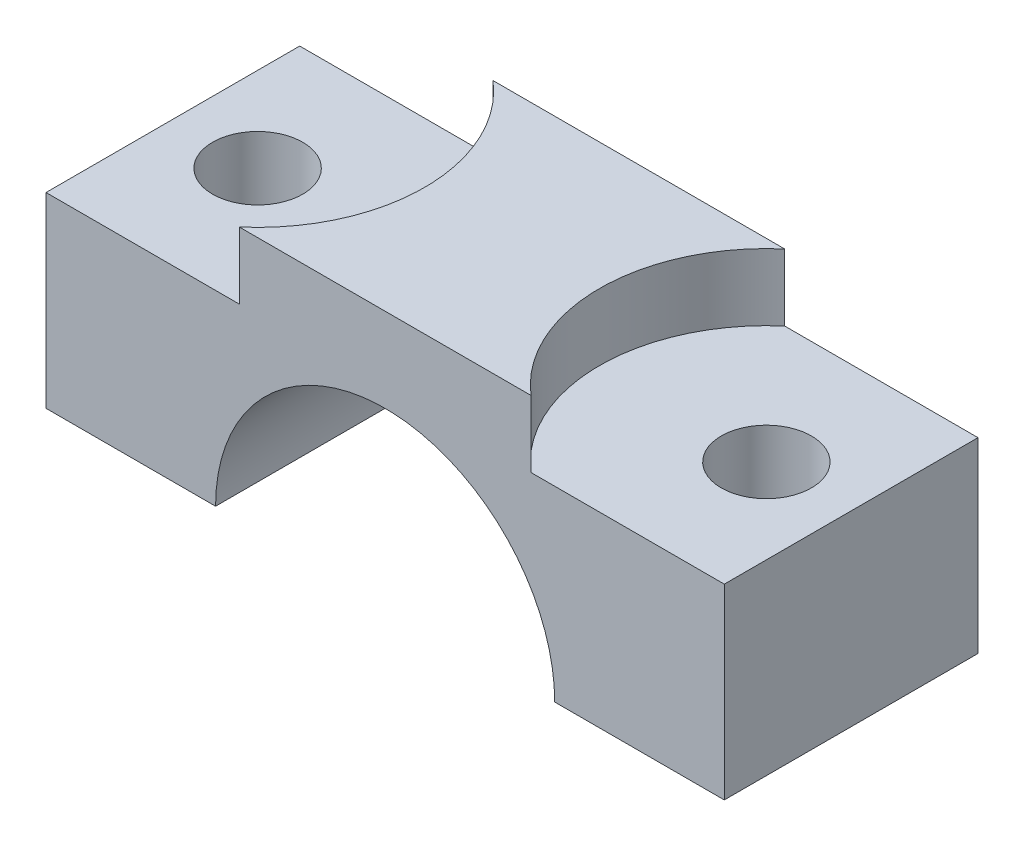
ISO-10303-21;
HEADER;
FILE_DESCRIPTION(('STEP AP214'),'2;1');
FILE_NAME('part.step','',(''),(''),'','','');
FILE_SCHEMA(('AUTOMOTIVE_DESIGN { 1 0 10303 214 1 1 1 1 }'));
ENDSEC;
DATA;
#1=APPLICATION_CONTEXT('core data for automotive mechanical design processes');
#2=APPLICATION_PROTOCOL_DEFINITION('international standard','automotive_design',2000,#1);
#3=PRODUCT_CONTEXT('',#1,'mechanical');
#4=PRODUCT('Part','Part','',(#3));
#5=PRODUCT_RELATED_PRODUCT_CATEGORY('part','',(#4));
#6=PRODUCT_DEFINITION_FORMATION('','',#4);
#7=PRODUCT_DEFINITION_CONTEXT('part definition',#1,'design');
#8=PRODUCT_DEFINITION('design','',#6,#7);
#9=PRODUCT_DEFINITION_SHAPE('','',#8);
#10=(LENGTH_UNIT() NAMED_UNIT(*) SI_UNIT(.MILLI.,.METRE.));
#11=(NAMED_UNIT(*) PLANE_ANGLE_UNIT() SI_UNIT($,.RADIAN.));
#12=(NAMED_UNIT(*) SI_UNIT($,.STERADIAN.) SOLID_ANGLE_UNIT());
#13=UNCERTAINTY_MEASURE_WITH_UNIT(LENGTH_MEASURE(1.E-05),#10,'distance_accuracy_value','');
#14=(GEOMETRIC_REPRESENTATION_CONTEXT(3) GLOBAL_UNCERTAINTY_ASSIGNED_CONTEXT((#13)) GLOBAL_UNIT_ASSIGNED_CONTEXT((#10,
#11,#12)) REPRESENTATION_CONTEXT('',''));
#15=CARTESIAN_POINT('',(0.,0.,0.));
#16=DIRECTION('',(0.,0.,1.));
#17=DIRECTION('',(1.,0.,0.));
#18=AXIS2_PLACEMENT_3D('',#15,#16,#17);
#19=CARTESIAN_POINT('',(-25.4,19.,9.5));
#20=DIRECTION('',(0.,-1.,0.));
#21=DIRECTION('',(0.,0.,-1.));
#22=AXIS2_PLACEMENT_3D('',#19,#20,#21);
#23=PLANE('',#22);
#24=CARTESIAN_POINT('',(-19.05,19.,0.));
#25=DIRECTION('',(0.,1.,0.));
#26=DIRECTION('',(0.,0.,1.));
#27=AXIS2_PLACEMENT_3D('',#24,#25,#26);
#28=CIRCLE('',#27,12.5);
#29=CARTESIAN_POINT('',(-10.925961595364,19.,9.5));
#30=VERTEX_POINT('',#29);
#31=CARTESIAN_POINT('',(-10.925961595364,19.,-9.5));
#32=VERTEX_POINT('',#31);
#33=EDGE_CURVE('E56',#30,#32,#28,.T.);
#34=ORIENTED_EDGE('',*,*,#33,.F.);
#35=DIRECTION('',(-1.,0.,0.));
#36=VECTOR('',#35,1.);
#37=CARTESIAN_POINT('',(-25.4,19.,9.5));
#38=LINE('',#37,#36);
#39=CARTESIAN_POINT('',(10.925961595364,19.,9.5));
#40=VERTEX_POINT('',#39);
#41=EDGE_CURVE('E130',#40,#30,#38,.T.);
#42=ORIENTED_EDGE('',*,*,#41,.F.);
#43=CARTESIAN_POINT('',(19.05,19.,0.));
#44=DIRECTION('',(0.,1.,0.));
#45=DIRECTION('',(0.,0.,1.));
#46=AXIS2_PLACEMENT_3D('',#43,#44,#45);
#47=CIRCLE('',#46,12.5);
#48=CARTESIAN_POINT('',(10.925961595364,19.,-9.5));
#49=VERTEX_POINT('',#48);
#50=EDGE_CURVE('E192',#49,#40,#47,.T.);
#51=ORIENTED_EDGE('',*,*,#50,.F.);
#52=DIRECTION('',(-1.,0.,0.));
#53=VECTOR('',#52,1.);
#54=CARTESIAN_POINT('',(-25.4,19.,-9.5));
#55=LINE('',#54,#53);
#56=EDGE_CURVE('E132',#49,#32,#55,.T.);
#57=ORIENTED_EDGE('',*,*,#56,.T.);
#58=EDGE_LOOP('',(#34,#42,#51,#57));
#59=FACE_BOUND('',#58,.T.);
#60=ADVANCED_FACE('F41',(#59),#23,.F.);
#61=CARTESIAN_POINT('',(-25.4,0.,9.5));
#62=DIRECTION('',(1.,0.,0.));
#63=DIRECTION('',(0.,0.,-1.));
#64=AXIS2_PLACEMENT_3D('',#61,#62,#63);
#65=PLANE('',#64);
#66=DIRECTION('',(0.,-1.,0.));
#67=VECTOR('',#66,1.);
#68=CARTESIAN_POINT('',(-25.4,0.,9.5));
#69=LINE('',#68,#67);
#70=CARTESIAN_POINT('',(-25.4,14.,9.5));
#71=VERTEX_POINT('',#70);
#72=CARTESIAN_POINT('',(-25.4,0.,9.5));
#73=VERTEX_POINT('',#72);
#74=EDGE_CURVE('E160',#71,#73,#69,.T.);
#75=ORIENTED_EDGE('',*,*,#74,.F.);
#76=DIRECTION('',(0.,0.,-1.));
#77=VECTOR('',#76,1.);
#78=CARTESIAN_POINT('',(-25.4,14.,9.5));
#79=LINE('',#78,#77);
#80=CARTESIAN_POINT('',(-25.4,14.,-9.5));
#81=VERTEX_POINT('',#80);
#82=EDGE_CURVE('E123',#71,#81,#79,.T.);
#83=ORIENTED_EDGE('',*,*,#82,.T.);
#84=DIRECTION('',(0.,-1.,0.));
#85=VECTOR('',#84,1.);
#86=CARTESIAN_POINT('',(-25.4,0.,-9.5));
#87=LINE('',#86,#85);
#88=CARTESIAN_POINT('',(-25.4,0.,-9.5));
#89=VERTEX_POINT('',#88);
#90=EDGE_CURVE('E149',#81,#89,#87,.T.);
#91=ORIENTED_EDGE('',*,*,#90,.T.);
#92=DIRECTION('',(0.,0.,-1.));
#93=VECTOR('',#92,1.);
#94=CARTESIAN_POINT('',(-25.4,0.,9.5));
#95=LINE('',#94,#93);
#96=EDGE_CURVE('E167',#73,#89,#95,.T.);
#97=ORIENTED_EDGE('',*,*,#96,.F.);
#98=EDGE_LOOP('',(#75,#83,#91,#97));
#99=FACE_BOUND('',#98,.T.);
#100=ADVANCED_FACE('F43',(#99),#65,.F.);
#101=CARTESIAN_POINT('',(-25.4,0.,9.5));
#102=DIRECTION('',(0.,1.,0.));
#103=DIRECTION('',(0.,0.,1.));
#104=AXIS2_PLACEMENT_3D('',#101,#102,#103);
#105=PLANE('',#104);
#106=CARTESIAN_POINT('',(-19.05,0.,0.));
#107=DIRECTION('',(0.,1.,0.));
#108=DIRECTION('',(0.,0.,1.));
#109=AXIS2_PLACEMENT_3D('',#106,#107,#108);
#110=CIRCLE('',#109,3.375);
#111=CARTESIAN_POINT('',(-19.05,0.,3.375));
#112=VERTEX_POINT('',#111);
#113=EDGE_CURVE('E124',#112,#112,#110,.T.);
#114=ORIENTED_EDGE('',*,*,#113,.T.);
#115=EDGE_LOOP('',(#114));
#116=FACE_BOUND('',#115,.T.);
#117=DIRECTION('',(1.,0.,0.));
#118=VECTOR('',#117,1.);
#119=CARTESIAN_POINT('',(-25.4,0.,-9.5));
#120=LINE('',#119,#118);
#121=CARTESIAN_POINT('',(-12.7,0.,-9.5));
#122=VERTEX_POINT('',#121);
#123=EDGE_CURVE('E151',#89,#122,#120,.T.);
#124=ORIENTED_EDGE('',*,*,#123,.T.);
#125=DIRECTION('',(0.,0.,-1.));
#126=VECTOR('',#125,1.);
#127=CARTESIAN_POINT('',(-12.7,0.,9.5));
#128=LINE('',#127,#126);
#129=CARTESIAN_POINT('',(-12.7,0.,9.5));
#130=VERTEX_POINT('',#129);
#131=EDGE_CURVE('E164',#130,#122,#128,.T.);
#132=ORIENTED_EDGE('',*,*,#131,.F.);
#133=DIRECTION('',(1.,0.,0.));
#134=VECTOR('',#133,1.);
#135=CARTESIAN_POINT('',(-25.4,0.,9.5));
#136=LINE('',#135,#134);
#137=EDGE_CURVE('E208',#73,#130,#136,.T.);
#138=ORIENTED_EDGE('',*,*,#137,.F.);
#139=ORIENTED_EDGE('',*,*,#96,.T.);
#140=EDGE_LOOP('',(#124,#132,#138,#139));
#141=FACE_BOUND('',#140,.T.);
#142=ADVANCED_FACE('F245',(#116,#141),#105,.F.);
#143=CARTESIAN_POINT('',(0.,0.,9.5));
#144=DIRECTION('',(0.,0.,-1.));
#145=DIRECTION('',(-1.,0.,0.));
#146=AXIS2_PLACEMENT_3D('',#143,#144,#145);
#147=CYLINDRICAL_SURFACE('',#146,12.7);
#148=CARTESIAN_POINT('',(0.,0.,-9.5));
#149=DIRECTION('',(0.,0.,-1.));
#150=DIRECTION('',(-1.,0.,0.));
#151=AXIS2_PLACEMENT_3D('',#148,#149,#150);
#152=CIRCLE('',#151,12.7);
#153=CARTESIAN_POINT('',(12.7,0.,-9.5));
#154=VERTEX_POINT('',#153);
#155=EDGE_CURVE('E153',#122,#154,#152,.T.);
#156=ORIENTED_EDGE('',*,*,#155,.T.);
#157=DIRECTION('',(0.,0.,-1.));
#158=VECTOR('',#157,1.);
#159=CARTESIAN_POINT('',(12.7,0.,9.5));
#160=LINE('',#159,#158);
#161=CARTESIAN_POINT('',(12.7,0.,9.5));
#162=VERTEX_POINT('',#161);
#163=EDGE_CURVE('E142',#162,#154,#160,.T.);
#164=ORIENTED_EDGE('',*,*,#163,.F.);
#165=CARTESIAN_POINT('',(0.,0.,9.5));
#166=DIRECTION('',(0.,0.,-1.));
#167=DIRECTION('',(-1.,0.,0.));
#168=AXIS2_PLACEMENT_3D('',#165,#166,#167);
#169=CIRCLE('',#168,12.7);
#170=EDGE_CURVE('E210',#130,#162,#169,.T.);
#171=ORIENTED_EDGE('',*,*,#170,.F.);
#172=ORIENTED_EDGE('',*,*,#131,.T.);
#173=EDGE_LOOP('',(#156,#164,#171,#172));
#174=FACE_BOUND('',#173,.T.);
#175=ADVANCED_FACE('F253',(#174),#147,.F.);
#176=CARTESIAN_POINT('',(12.7,0.,9.5));
#177=DIRECTION('',(0.,1.,0.));
#178=DIRECTION('',(-1.,0.,0.));
#179=AXIS2_PLACEMENT_3D('',#176,#177,#178);
#180=PLANE('',#179);
#181=CARTESIAN_POINT('',(19.05,0.,0.));
#182=DIRECTION('',(0.,1.,0.));
#183=DIRECTION('',(0.,0.,1.));
#184=AXIS2_PLACEMENT_3D('',#181,#182,#183);
#185=CIRCLE('',#184,3.375);
#186=CARTESIAN_POINT('',(19.05,0.,3.375));
#187=VERTEX_POINT('',#186);
#188=EDGE_CURVE('E203',#187,#187,#185,.T.);
#189=ORIENTED_EDGE('',*,*,#188,.T.);
#190=EDGE_LOOP('',(#189));
#191=FACE_BOUND('',#190,.T.);
#192=DIRECTION('',(1.,0.,0.));
#193=VECTOR('',#192,1.);
#194=CARTESIAN_POINT('',(12.7,0.,-9.5));
#195=LINE('',#194,#193);
#196=CARTESIAN_POINT('',(25.4,0.,-9.5));
#197=VERTEX_POINT('',#196);
#198=EDGE_CURVE('E155',#154,#197,#195,.T.);
#199=ORIENTED_EDGE('',*,*,#198,.T.);
#200=DIRECTION('',(0.,0.,-1.));
#201=VECTOR('',#200,1.);
#202=CARTESIAN_POINT('',(25.4,0.,9.5));
#203=LINE('',#202,#201);
#204=CARTESIAN_POINT('',(25.4,0.,9.5));
#205=VERTEX_POINT('',#204);
#206=EDGE_CURVE('E138',#205,#197,#203,.T.);
#207=ORIENTED_EDGE('',*,*,#206,.F.);
#208=DIRECTION('',(1.,0.,0.));
#209=VECTOR('',#208,1.);
#210=CARTESIAN_POINT('',(12.7,0.,9.5));
#211=LINE('',#210,#209);
#212=EDGE_CURVE('E145',#162,#205,#211,.T.);
#213=ORIENTED_EDGE('',*,*,#212,.F.);
#214=ORIENTED_EDGE('',*,*,#163,.T.);
#215=EDGE_LOOP('',(#199,#207,#213,#214));
#216=FACE_BOUND('',#215,.T.);
#217=ADVANCED_FACE('F217',(#191,#216),#180,.F.);
#218=CARTESIAN_POINT('',(25.4,0.,9.5));
#219=DIRECTION('',(-1.,0.,0.));
#220=DIRECTION('',(0.,0.,1.));
#221=AXIS2_PLACEMENT_3D('',#218,#219,#220);
#222=PLANE('',#221);
#223=DIRECTION('',(0.,1.,0.));
#224=VECTOR('',#223,1.);
#225=CARTESIAN_POINT('',(25.4,0.,-9.5));
#226=LINE('',#225,#224);
#227=CARTESIAN_POINT('',(25.4,14.,-9.5));
#228=VERTEX_POINT('',#227);
#229=EDGE_CURVE('E157',#197,#228,#226,.T.);
#230=ORIENTED_EDGE('',*,*,#229,.T.);
#231=DIRECTION('',(0.,0.,1.));
#232=VECTOR('',#231,1.);
#233=CARTESIAN_POINT('',(25.4,14.,9.5));
#234=LINE('',#233,#232);
#235=CARTESIAN_POINT('',(25.4,14.,9.5));
#236=VERTEX_POINT('',#235);
#237=EDGE_CURVE('E64',#228,#236,#234,.T.);
#238=ORIENTED_EDGE('',*,*,#237,.T.);
#239=DIRECTION('',(0.,1.,0.));
#240=VECTOR('',#239,1.);
#241=CARTESIAN_POINT('',(25.4,0.,9.5));
#242=LINE('',#241,#240);
#243=EDGE_CURVE('E139',#205,#236,#242,.T.);
#244=ORIENTED_EDGE('',*,*,#243,.F.);
#245=ORIENTED_EDGE('',*,*,#206,.T.);
#246=EDGE_LOOP('',(#230,#238,#244,#245));
#247=FACE_BOUND('',#246,.T.);
#248=ADVANCED_FACE('F221',(#247),#222,.F.);
#249=CARTESIAN_POINT('',(0.,0.,9.5));
#250=DIRECTION('',(0.,0.,-1.));
#251=DIRECTION('',(-1.,0.,0.));
#252=AXIS2_PLACEMENT_3D('',#249,#250,#251);
#253=PLANE('',#252);
#254=DIRECTION('',(0.,1.,0.));
#255=VECTOR('',#254,1.);
#256=CARTESIAN_POINT('',(-10.925961595364,19.,9.5));
#257=LINE('',#256,#255);
#258=CARTESIAN_POINT('',(-10.925961595364,14.,9.5));
#259=VERTEX_POINT('',#258);
#260=EDGE_CURVE('E116',#30,#259,#257,.F.);
#261=ORIENTED_EDGE('',*,*,#260,.T.);
#262=DIRECTION('',(-1.,0.,0.));
#263=VECTOR('',#262,1.);
#264=CARTESIAN_POINT('',(0.,14.,9.5));
#265=LINE('',#264,#263);
#266=EDGE_CURVE('E181',#259,#71,#265,.T.);
#267=ORIENTED_EDGE('',*,*,#266,.T.);
#268=ORIENTED_EDGE('',*,*,#74,.T.);
#269=ORIENTED_EDGE('',*,*,#137,.T.);
#270=ORIENTED_EDGE('',*,*,#170,.T.);
#271=ORIENTED_EDGE('',*,*,#212,.T.);
#272=ORIENTED_EDGE('',*,*,#243,.T.);
#273=DIRECTION('',(-1.,0.,0.));
#274=VECTOR('',#273,1.);
#275=CARTESIAN_POINT('',(0.,14.,9.5));
#276=LINE('',#275,#274);
#277=CARTESIAN_POINT('',(10.925961595364,14.,9.5));
#278=VERTEX_POINT('',#277);
#279=EDGE_CURVE('E171',#236,#278,#276,.T.);
#280=ORIENTED_EDGE('',*,*,#279,.T.);
#281=DIRECTION('',(0.,1.,0.));
#282=VECTOR('',#281,1.);
#283=CARTESIAN_POINT('',(10.925961595364,19.,9.5));
#284=LINE('',#283,#282);
#285=EDGE_CURVE('E137',#278,#40,#284,.T.);
#286=ORIENTED_EDGE('',*,*,#285,.T.);
#287=ORIENTED_EDGE('',*,*,#41,.T.);
#288=EDGE_LOOP('',(#261,#267,#268,#269,#270,#271,#272,#280,#286,#287));
#289=FACE_BOUND('',#288,.T.);
#290=ADVANCED_FACE('F135',(#289),#253,.F.);
#291=CARTESIAN_POINT('',(0.,0.,-9.5));
#292=DIRECTION('',(0.,0.,-1.));
#293=DIRECTION('',(-1.,0.,0.));
#294=AXIS2_PLACEMENT_3D('',#291,#292,#293);
#295=PLANE('',#294);
#296=DIRECTION('',(-1.,0.,0.));
#297=VECTOR('',#296,1.);
#298=CARTESIAN_POINT('',(0.,14.,-9.5));
#299=LINE('',#298,#297);
#300=CARTESIAN_POINT('',(-10.925961595364,14.,-9.5));
#301=VERTEX_POINT('',#300);
#302=EDGE_CURVE('E11',#301,#81,#299,.T.);
#303=ORIENTED_EDGE('',*,*,#302,.F.);
#304=DIRECTION('',(0.,1.,0.));
#305=VECTOR('',#304,1.);
#306=CARTESIAN_POINT('',(-10.925961595364,19.,-9.5));
#307=LINE('',#306,#305);
#308=EDGE_CURVE('E49',#32,#301,#307,.F.);
#309=ORIENTED_EDGE('',*,*,#308,.F.);
#310=ORIENTED_EDGE('',*,*,#56,.F.);
#311=DIRECTION('',(0.,1.,0.));
#312=VECTOR('',#311,1.);
#313=CARTESIAN_POINT('',(10.925961595364,19.,-9.5));
#314=LINE('',#313,#312);
#315=CARTESIAN_POINT('',(10.925961595364,14.,-9.5));
#316=VERTEX_POINT('',#315);
#317=EDGE_CURVE('E175',#316,#49,#314,.T.);
#318=ORIENTED_EDGE('',*,*,#317,.F.);
#319=DIRECTION('',(-1.,0.,0.));
#320=VECTOR('',#319,1.);
#321=CARTESIAN_POINT('',(0.,14.,-9.5));
#322=LINE('',#321,#320);
#323=EDGE_CURVE('E173',#228,#316,#322,.T.);
#324=ORIENTED_EDGE('',*,*,#323,.F.);
#325=ORIENTED_EDGE('',*,*,#229,.F.);
#326=ORIENTED_EDGE('',*,*,#198,.F.);
#327=ORIENTED_EDGE('',*,*,#155,.F.);
#328=ORIENTED_EDGE('',*,*,#123,.F.);
#329=ORIENTED_EDGE('',*,*,#90,.F.);
#330=EDGE_LOOP('',(#303,#309,#310,#318,#324,#325,#326,#327,#328,#329));
#331=FACE_BOUND('',#330,.T.);
#332=ADVANCED_FACE('F185',(#331),#295,.T.);
#333=CARTESIAN_POINT('',(22.425,14.,0.));
#334=DIRECTION('',(0.,-1.,0.));
#335=DIRECTION('',(0.,0.,-1.));
#336=AXIS2_PLACEMENT_3D('',#333,#334,#335);
#337=PLANE('',#336);
#338=CARTESIAN_POINT('',(19.05,14.,0.));
#339=DIRECTION('',(0.,1.,0.));
#340=DIRECTION('',(0.,0.,1.));
#341=AXIS2_PLACEMENT_3D('',#338,#339,#340);
#342=CIRCLE('',#341,3.37500000000001);
#343=CARTESIAN_POINT('',(19.05,14.,3.37500000000001));
#344=VERTEX_POINT('',#343);
#345=EDGE_CURVE('E200',#344,#344,#342,.T.);
#346=ORIENTED_EDGE('',*,*,#345,.F.);
#347=EDGE_LOOP('',(#346));
#348=FACE_BOUND('',#347,.T.);
#349=ORIENTED_EDGE('',*,*,#237,.F.);
#350=ORIENTED_EDGE('',*,*,#323,.T.);
#351=CARTESIAN_POINT('',(19.05,14.,0.));
#352=DIRECTION('',(0.,1.,0.));
#353=DIRECTION('',(0.,0.,1.));
#354=AXIS2_PLACEMENT_3D('',#351,#352,#353);
#355=CIRCLE('',#354,12.5);
#356=EDGE_CURVE('E197',#316,#278,#355,.T.);
#357=ORIENTED_EDGE('',*,*,#356,.T.);
#358=ORIENTED_EDGE('',*,*,#279,.F.);
#359=EDGE_LOOP('',(#349,#350,#357,#358));
#360=FACE_BOUND('',#359,.T.);
#361=ADVANCED_FACE('F224',(#348,#360),#337,.F.);
#362=CARTESIAN_POINT('',(19.05,19.,0.));
#363=DIRECTION('',(0.,1.,0.));
#364=DIRECTION('',(0.,0.,1.));
#365=AXIS2_PLACEMENT_3D('',#362,#363,#364);
#366=CYLINDRICAL_SURFACE('',#365,3.375);
#367=ORIENTED_EDGE('',*,*,#188,.F.);
#368=EDGE_LOOP('',(#367));
#369=FACE_BOUND('',#368,.T.);
#370=ORIENTED_EDGE('',*,*,#345,.T.);
#371=EDGE_LOOP('',(#370));
#372=FACE_BOUND('',#371,.T.);
#373=ADVANCED_FACE('F228',(#369,#372),#366,.F.);
#374=CARTESIAN_POINT('',(19.05,19.,0.));
#375=DIRECTION('',(0.,1.,0.));
#376=DIRECTION('',(0.,0.,1.));
#377=AXIS2_PLACEMENT_3D('',#374,#375,#376);
#378=CYLINDRICAL_SURFACE('',#377,12.5);
#379=ORIENTED_EDGE('',*,*,#317,.T.);
#380=ORIENTED_EDGE('',*,*,#50,.T.);
#381=ORIENTED_EDGE('',*,*,#285,.F.);
#382=ORIENTED_EDGE('',*,*,#356,.F.);
#383=EDGE_LOOP('',(#379,#380,#381,#382));
#384=FACE_BOUND('',#383,.T.);
#385=ADVANCED_FACE('F226',(#384),#378,.F.);
#386=CARTESIAN_POINT('',(-15.675,14.,0.));
#387=DIRECTION('',(0.,-1.,0.));
#388=DIRECTION('',(0.,0.,-1.));
#389=AXIS2_PLACEMENT_3D('',#386,#387,#388);
#390=PLANE('',#389);
#391=CARTESIAN_POINT('',(-19.05,14.,0.));
#392=DIRECTION('',(0.,1.,0.));
#393=DIRECTION('',(0.,0.,1.));
#394=AXIS2_PLACEMENT_3D('',#391,#392,#393);
#395=CIRCLE('',#394,3.37500000000001);
#396=CARTESIAN_POINT('',(-19.05,14.,3.37500000000001));
#397=VERTEX_POINT('',#396);
#398=EDGE_CURVE('E182',#397,#397,#395,.T.);
#399=ORIENTED_EDGE('',*,*,#398,.F.);
#400=EDGE_LOOP('',(#399));
#401=FACE_BOUND('',#400,.T.);
#402=CARTESIAN_POINT('',(-19.05,14.,0.));
#403=DIRECTION('',(0.,1.,0.));
#404=DIRECTION('',(0.,0.,1.));
#405=AXIS2_PLACEMENT_3D('',#402,#403,#404);
#406=CIRCLE('',#405,12.5);
#407=EDGE_CURVE('E119',#259,#301,#406,.T.);
#408=ORIENTED_EDGE('',*,*,#407,.T.);
#409=ORIENTED_EDGE('',*,*,#302,.T.);
#410=ORIENTED_EDGE('',*,*,#82,.F.);
#411=ORIENTED_EDGE('',*,*,#266,.F.);
#412=EDGE_LOOP('',(#408,#409,#410,#411));
#413=FACE_BOUND('',#412,.T.);
#414=ADVANCED_FACE('F179',(#401,#413),#390,.F.);
#415=CARTESIAN_POINT('',(-19.05,19.,0.));
#416=DIRECTION('',(0.,1.,0.));
#417=DIRECTION('',(0.,0.,1.));
#418=AXIS2_PLACEMENT_3D('',#415,#416,#417);
#419=CYLINDRICAL_SURFACE('',#418,12.5);
#420=ORIENTED_EDGE('',*,*,#33,.T.);
#421=ORIENTED_EDGE('',*,*,#308,.T.);
#422=ORIENTED_EDGE('',*,*,#407,.F.);
#423=ORIENTED_EDGE('',*,*,#260,.F.);
#424=EDGE_LOOP('',(#420,#421,#422,#423));
#425=FACE_BOUND('',#424,.T.);
#426=ADVANCED_FACE('F117',(#425),#419,.F.);
#427=CARTESIAN_POINT('',(-19.05,19.,0.));
#428=DIRECTION('',(0.,1.,0.));
#429=DIRECTION('',(0.,0.,1.));
#430=AXIS2_PLACEMENT_3D('',#427,#428,#429);
#431=CYLINDRICAL_SURFACE('',#430,3.375);
#432=ORIENTED_EDGE('',*,*,#113,.F.);
#433=EDGE_LOOP('',(#432));
#434=FACE_BOUND('',#433,.T.);
#435=ORIENTED_EDGE('',*,*,#398,.T.);
#436=EDGE_LOOP('',(#435));
#437=FACE_BOUND('',#436,.T.);
#438=ADVANCED_FACE('F271',(#434,#437),#431,.F.);
#439=CLOSED_SHELL('',(#60,#100,#142,#175,#217,#248,#290,#332,#361,#373,#385,#414,#426,#438));
#440=MANIFOLD_SOLID_BREP('B2',#439);
#441=ADVANCED_BREP_SHAPE_REPRESENTATION('',(#18,#440),#14);
#442=SHAPE_DEFINITION_REPRESENTATION(#9,#441);
ENDSEC;
END-ISO-10303-21;
